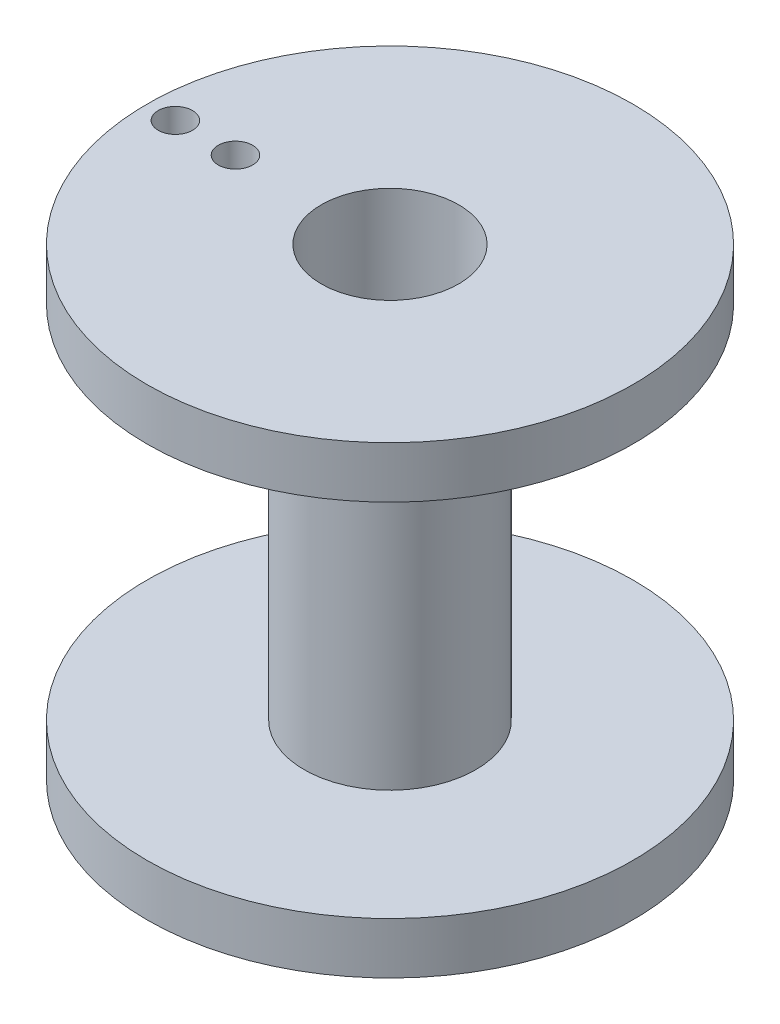
ISO-10303-21;
HEADER;
FILE_DESCRIPTION(('STEP AP214'),'2;1');
FILE_NAME('part.step','',(''),(''),'','','');
FILE_SCHEMA(('AUTOMOTIVE_DESIGN { 1 0 10303 214 1 1 1 1 }'));
ENDSEC;
DATA;
#1=APPLICATION_CONTEXT('core data for automotive mechanical design processes');
#2=APPLICATION_PROTOCOL_DEFINITION('international standard','automotive_design',2000,#1);
#3=PRODUCT_CONTEXT('',#1,'mechanical');
#4=PRODUCT('Part','Part','',(#3));
#5=PRODUCT_RELATED_PRODUCT_CATEGORY('part','',(#4));
#6=PRODUCT_DEFINITION_FORMATION('','',#4);
#7=PRODUCT_DEFINITION_CONTEXT('part definition',#1,'design');
#8=PRODUCT_DEFINITION('design','',#6,#7);
#9=PRODUCT_DEFINITION_SHAPE('','',#8);
#10=(LENGTH_UNIT() NAMED_UNIT(*) SI_UNIT(.MILLI.,.METRE.));
#11=(NAMED_UNIT(*) PLANE_ANGLE_UNIT() SI_UNIT($,.RADIAN.));
#12=(NAMED_UNIT(*) SI_UNIT($,.STERADIAN.) SOLID_ANGLE_UNIT());
#13=UNCERTAINTY_MEASURE_WITH_UNIT(LENGTH_MEASURE(1.E-05),#10,'distance_accuracy_value','');
#14=(GEOMETRIC_REPRESENTATION_CONTEXT(3) GLOBAL_UNCERTAINTY_ASSIGNED_CONTEXT((#13)) GLOBAL_UNIT_ASSIGNED_CONTEXT((#10,
#11,#12)) REPRESENTATION_CONTEXT('',''));
#15=CARTESIAN_POINT('',(0.,0.,0.));
#16=DIRECTION('',(0.,0.,1.));
#17=DIRECTION('',(1.,0.,0.));
#18=AXIS2_PLACEMENT_3D('',#15,#16,#17);
#19=CARTESIAN_POINT('',(0.,3.,0.));
#20=DIRECTION('',(0.,-1.,0.));
#21=DIRECTION('',(0.,0.,-1.));
#22=AXIS2_PLACEMENT_3D('',#19,#20,#21);
#23=CYLINDRICAL_SURFACE('',#22,14.15);
#24=CARTESIAN_POINT('',(0.,3.,0.));
#25=DIRECTION('',(0.,1.,0.));
#26=DIRECTION('',(0.,0.,1.));
#27=AXIS2_PLACEMENT_3D('',#24,#25,#26);
#28=CIRCLE('',#27,14.15);
#29=CARTESIAN_POINT('',(0.,3.,14.15));
#30=VERTEX_POINT('',#29);
#31=EDGE_CURVE('E45',#30,#30,#28,.T.);
#32=ORIENTED_EDGE('',*,*,#31,.F.);
#33=EDGE_LOOP('',(#32));
#34=FACE_BOUND('',#33,.T.);
#35=CARTESIAN_POINT('',(0.,0.,0.));
#36=DIRECTION('',(0.,1.,0.));
#37=DIRECTION('',(0.,0.,1.));
#38=AXIS2_PLACEMENT_3D('',#35,#36,#37);
#39=CIRCLE('',#38,14.15);
#40=CARTESIAN_POINT('',(0.,0.,14.15));
#41=VERTEX_POINT('',#40);
#42=EDGE_CURVE('E40',#41,#41,#39,.T.);
#43=ORIENTED_EDGE('',*,*,#42,.T.);
#44=EDGE_LOOP('',(#43));
#45=FACE_BOUND('',#44,.T.);
#46=ADVANCED_FACE('F37',(#34,#45),#23,.T.);
#47=CARTESIAN_POINT('',(0.,3.,0.));
#48=DIRECTION('',(0.,1.,0.));
#49=DIRECTION('',(0.,0.,1.));
#50=AXIS2_PLACEMENT_3D('',#47,#48,#49);
#51=PLANE('',#50);
#52=CARTESIAN_POINT('',(0.,3.,0.));
#53=DIRECTION('',(0.,1.,0.));
#54=DIRECTION('',(0.,0.,1.));
#55=AXIS2_PLACEMENT_3D('',#52,#53,#54);
#56=CIRCLE('',#55,5.);
#57=CARTESIAN_POINT('',(0.,3.,-5.));
#58=VERTEX_POINT('',#57);
#59=EDGE_CURVE('E10',#58,#58,#56,.T.);
#60=ORIENTED_EDGE('',*,*,#59,.F.);
#61=EDGE_LOOP('',(#60));
#62=FACE_BOUND('',#61,.T.);
#63=ORIENTED_EDGE('',*,*,#31,.T.);
#64=EDGE_LOOP('',(#63));
#65=FACE_BOUND('',#64,.T.);
#66=ADVANCED_FACE('F119',(#62,#65),#51,.T.);
#67=CARTESIAN_POINT('',(0.,0.,0.));
#68=DIRECTION('',(0.,1.,0.));
#69=DIRECTION('',(0.,0.,1.));
#70=AXIS2_PLACEMENT_3D('',#67,#68,#69);
#71=PLANE('',#70);
#72=CARTESIAN_POINT('',(0.,0.,0.));
#73=DIRECTION('',(0.,1.,0.));
#74=DIRECTION('',(0.,0.,1.));
#75=AXIS2_PLACEMENT_3D('',#72,#73,#74);
#76=CIRCLE('',#75,4.);
#77=CARTESIAN_POINT('',(0.,0.,4.));
#78=VERTEX_POINT('',#77);
#79=EDGE_CURVE('E61',#78,#78,#76,.T.);
#80=ORIENTED_EDGE('',*,*,#79,.T.);
#81=EDGE_LOOP('',(#80));
#82=FACE_BOUND('',#81,.T.);
#83=ORIENTED_EDGE('',*,*,#42,.F.);
#84=EDGE_LOOP('',(#83));
#85=FACE_BOUND('',#84,.T.);
#86=ADVANCED_FACE('F114',(#82,#85),#71,.F.);
#87=CARTESIAN_POINT('',(0.,24.,0.));
#88=DIRECTION('',(0.,-1.,0.));
#89=DIRECTION('',(0.,0.,-1.));
#90=AXIS2_PLACEMENT_3D('',#87,#88,#89);
#91=CYLINDRICAL_SURFACE('',#90,5.);
#92=CARTESIAN_POINT('',(0.,24.,0.));
#93=DIRECTION('',(0.,1.,0.));
#94=DIRECTION('',(0.,0.,1.));
#95=AXIS2_PLACEMENT_3D('',#92,#93,#94);
#96=CIRCLE('',#95,5.);
#97=CARTESIAN_POINT('',(0.,24.,-5.));
#98=VERTEX_POINT('',#97);
#99=EDGE_CURVE('E52',#98,#98,#96,.T.);
#100=CARTESIAN_POINT('',(0.,24.,-5.));
#101=CARTESIAN_POINT('',(0.,23.78125,-5.));
#102=CARTESIAN_POINT('',(0.,23.5625,-5.));
#103=CARTESIAN_POINT('',(0.,23.125,-5.));
#104=CARTESIAN_POINT('',(0.,22.90625,-5.));
#105=CARTESIAN_POINT('',(0.,22.46875,-5.));
#106=CARTESIAN_POINT('',(0.,22.25,-5.));
#107=CARTESIAN_POINT('',(0.,21.8125,-5.));
#108=CARTESIAN_POINT('',(0.,21.59375,-5.));
#109=CARTESIAN_POINT('',(0.,21.15625,-5.));
#110=CARTESIAN_POINT('',(0.,20.9375,-5.));
#111=CARTESIAN_POINT('',(0.,20.5,-5.));
#112=CARTESIAN_POINT('',(0.,20.28125,-5.));
#113=CARTESIAN_POINT('',(0.,19.84375,-5.));
#114=CARTESIAN_POINT('',(0.,19.625,-5.));
#115=CARTESIAN_POINT('',(0.,19.1875,-5.));
#116=CARTESIAN_POINT('',(0.,18.96875,-5.));
#117=CARTESIAN_POINT('',(0.,18.53125,-5.));
#118=CARTESIAN_POINT('',(0.,18.3125,-5.));
#119=CARTESIAN_POINT('',(0.,17.875,-5.));
#120=CARTESIAN_POINT('',(0.,17.65625,-5.));
#121=CARTESIAN_POINT('',(0.,17.21875,-5.));
#122=CARTESIAN_POINT('',(0.,17.,-5.));
#123=CARTESIAN_POINT('',(0.,16.5625,-5.));
#124=CARTESIAN_POINT('',(0.,16.34375,-5.));
#125=CARTESIAN_POINT('',(0.,15.90625,-5.));
#126=CARTESIAN_POINT('',(0.,15.6875,-5.));
#127=CARTESIAN_POINT('',(0.,15.25,-5.));
#128=CARTESIAN_POINT('',(0.,15.03125,-5.));
#129=CARTESIAN_POINT('',(0.,14.59375,-5.));
#130=CARTESIAN_POINT('',(0.,14.375,-5.));
#131=CARTESIAN_POINT('',(0.,13.9375,-5.));
#132=CARTESIAN_POINT('',(0.,13.71875,-5.));
#133=CARTESIAN_POINT('',(0.,13.28125,-5.));
#134=CARTESIAN_POINT('',(0.,13.0625,-5.));
#135=CARTESIAN_POINT('',(0.,12.625,-5.));
#136=CARTESIAN_POINT('',(0.,12.40625,-5.));
#137=CARTESIAN_POINT('',(0.,11.96875,-5.));
#138=CARTESIAN_POINT('',(0.,11.75,-5.));
#139=CARTESIAN_POINT('',(0.,11.3125,-5.));
#140=CARTESIAN_POINT('',(0.,11.09375,-5.));
#141=CARTESIAN_POINT('',(0.,10.65625,-5.));
#142=CARTESIAN_POINT('',(0.,10.4375,-5.));
#143=CARTESIAN_POINT('',(0.,10.,-5.));
#144=CARTESIAN_POINT('',(0.,9.78125,-5.));
#145=CARTESIAN_POINT('',(0.,9.34375,-5.));
#146=CARTESIAN_POINT('',(0.,9.125,-5.));
#147=CARTESIAN_POINT('',(0.,8.6875,-5.));
#148=CARTESIAN_POINT('',(0.,8.46875,-5.));
#149=CARTESIAN_POINT('',(0.,8.03125,-5.));
#150=CARTESIAN_POINT('',(0.,7.8125,-5.));
#151=CARTESIAN_POINT('',(0.,7.375,-5.));
#152=CARTESIAN_POINT('',(0.,7.15625,-5.));
#153=CARTESIAN_POINT('',(0.,6.71875,-5.));
#154=CARTESIAN_POINT('',(0.,6.5,-5.));
#155=CARTESIAN_POINT('',(0.,6.0625,-5.));
#156=CARTESIAN_POINT('',(0.,5.84375,-5.));
#157=CARTESIAN_POINT('',(0.,5.40625,-5.));
#158=CARTESIAN_POINT('',(0.,5.1875,-5.));
#159=CARTESIAN_POINT('',(0.,4.75,-5.));
#160=CARTESIAN_POINT('',(0.,4.53125,-5.));
#161=CARTESIAN_POINT('',(0.,4.09375,-5.));
#162=CARTESIAN_POINT('',(0.,3.875,-5.));
#163=CARTESIAN_POINT('',(0.,3.4375,-5.));
#164=CARTESIAN_POINT('',(0.,3.21875,-5.));
#165=CARTESIAN_POINT('',(0.,3.,-5.));
#166=B_SPLINE_CURVE_WITH_KNOTS('',3,(#100,#101,#102,#103,#104,#105,#106,#107,#108,#109,#110,
#111,#112,#113,#114,#115,#116,#117,#118,#119,#120,#121,#122,#123,#124,#125,#126,#127,#128,#129,
#130,#131,#132,#133,#134,#135,#136,#137,#138,#139,#140,#141,#142,#143,#144,#145,#146,#147,#148,
#149,#150,#151,#152,#153,#154,#155,#156,#157,#158,#159,#160,#161,#162,#163,#164,#165),
.UNSPECIFIED.,.F.,.F.,(4,2,2,2,2,2,2,2,2,2,2,2,2,2,2,2,2,2,2,2,2,2,2,2,2,2,2,2,2,2,2,2,4),(0.,
0.656250000000001,1.3125,1.96875,2.625,3.28125,3.9375,4.59375,5.25,5.90625,6.5625,7.21875,7.875,
8.53125,9.1875,9.84375,10.5,11.15625,11.8125,12.46875,13.125,13.78125,14.4375,15.09375,15.75,
16.40625,17.0625,17.71875,18.375,19.03125,19.6875,20.34375,21.),.UNSPECIFIED.);
#167=EDGE_CURVE('BSEAM105',#98,#58,#166,.T.);
#168=ORIENTED_EDGE('',*,*,#99,.F.);
#169=ORIENTED_EDGE('',*,*,#59,.T.);
#170=ORIENTED_EDGE('',*,*,#167,.T.);
#171=ORIENTED_EDGE('',*,*,#167,.F.);
#172=EDGE_LOOP('',(#168,#170,#169,#171));
#173=FACE_BOUND('',#172,.T.);
#174=ADVANCED_FACE('F105',(#173),#91,.T.);
#175=CARTESIAN_POINT('',(0.,27.,0.));
#176=DIRECTION('',(0.,-1.,0.));
#177=DIRECTION('',(0.,0.,-1.));
#178=AXIS2_PLACEMENT_3D('',#175,#176,#177);
#179=CYLINDRICAL_SURFACE('',#178,14.15);
#180=CARTESIAN_POINT('',(0.,27.,0.));
#181=DIRECTION('',(0.,1.,0.));
#182=DIRECTION('',(0.,0.,1.));
#183=AXIS2_PLACEMENT_3D('',#180,#181,#182);
#184=CIRCLE('',#183,14.15);
#185=CARTESIAN_POINT('',(0.,27.,14.15));
#186=VERTEX_POINT('',#185);
#187=EDGE_CURVE('E56',#186,#186,#184,.T.);
#188=ORIENTED_EDGE('',*,*,#187,.F.);
#189=EDGE_LOOP('',(#188));
#190=FACE_BOUND('',#189,.T.);
#191=CARTESIAN_POINT('',(0.,24.,0.));
#192=DIRECTION('',(0.,1.,0.));
#193=DIRECTION('',(0.,0.,1.));
#194=AXIS2_PLACEMENT_3D('',#191,#192,#193);
#195=CIRCLE('',#194,14.15);
#196=CARTESIAN_POINT('',(0.,24.,14.15));
#197=VERTEX_POINT('',#196);
#198=EDGE_CURVE('E57',#197,#197,#195,.T.);
#199=ORIENTED_EDGE('',*,*,#198,.T.);
#200=EDGE_LOOP('',(#199));
#201=FACE_BOUND('',#200,.T.);
#202=ADVANCED_FACE('F103',(#190,#201),#179,.T.);
#203=CARTESIAN_POINT('',(0.,27.,0.));
#204=DIRECTION('',(0.,1.,0.));
#205=DIRECTION('',(0.,0.,1.));
#206=AXIS2_PLACEMENT_3D('',#203,#204,#205);
#207=PLANE('',#206);
#208=CARTESIAN_POINT('',(-9.,27.,0.));
#209=DIRECTION('',(0.,1.,0.));
#210=DIRECTION('',(0.,0.,1.));
#211=AXIS2_PLACEMENT_3D('',#208,#209,#210);
#212=CIRCLE('',#211,1.);
#213=CARTESIAN_POINT('',(-9.,27.,1.));
#214=VERTEX_POINT('',#213);
#215=EDGE_CURVE('E69',#214,#214,#212,.T.);
#216=ORIENTED_EDGE('',*,*,#215,.F.);
#217=EDGE_LOOP('',(#216));
#218=FACE_BOUND('',#217,.T.);
#219=CARTESIAN_POINT('',(-12.5,27.,0.));
#220=DIRECTION('',(0.,1.,0.));
#221=DIRECTION('',(0.,0.,1.));
#222=AXIS2_PLACEMENT_3D('',#219,#220,#221);
#223=CIRCLE('',#222,1.);
#224=CARTESIAN_POINT('',(-12.5,27.,1.));
#225=VERTEX_POINT('',#224);
#226=EDGE_CURVE('E73',#225,#225,#223,.T.);
#227=ORIENTED_EDGE('',*,*,#226,.F.);
#228=EDGE_LOOP('',(#227));
#229=FACE_BOUND('',#228,.T.);
#230=CARTESIAN_POINT('',(0.,27.,0.));
#231=DIRECTION('',(0.,1.,0.));
#232=DIRECTION('',(0.,0.,1.));
#233=AXIS2_PLACEMENT_3D('',#230,#231,#232);
#234=CIRCLE('',#233,4.);
#235=CARTESIAN_POINT('',(0.,27.,4.));
#236=VERTEX_POINT('',#235);
#237=EDGE_CURVE('E65',#236,#236,#234,.T.);
#238=ORIENTED_EDGE('',*,*,#237,.F.);
#239=EDGE_LOOP('',(#238));
#240=FACE_BOUND('',#239,.T.);
#241=ORIENTED_EDGE('',*,*,#187,.T.);
#242=EDGE_LOOP('',(#241));
#243=FACE_BOUND('',#242,.T.);
#244=ADVANCED_FACE('F95',(#218,#229,#240,#243),#207,.T.);
#245=CARTESIAN_POINT('',(0.,24.,0.));
#246=DIRECTION('',(0.,1.,0.));
#247=DIRECTION('',(0.,0.,1.));
#248=AXIS2_PLACEMENT_3D('',#245,#246,#247);
#249=PLANE('',#248);
#250=CARTESIAN_POINT('',(-9.,24.,0.));
#251=DIRECTION('',(0.,1.,0.));
#252=DIRECTION('',(0.,0.,1.));
#253=AXIS2_PLACEMENT_3D('',#250,#251,#252);
#254=CIRCLE('',#253,1.);
#255=CARTESIAN_POINT('',(-9.,24.,1.));
#256=VERTEX_POINT('',#255);
#257=EDGE_CURVE('E77',#256,#256,#254,.F.);
#258=ORIENTED_EDGE('',*,*,#257,.F.);
#259=EDGE_LOOP('',(#258));
#260=FACE_BOUND('',#259,.T.);
#261=CARTESIAN_POINT('',(-12.5,24.,0.));
#262=DIRECTION('',(0.,1.,0.));
#263=DIRECTION('',(0.,0.,1.));
#264=AXIS2_PLACEMENT_3D('',#261,#262,#263);
#265=CIRCLE('',#264,1.);
#266=CARTESIAN_POINT('',(-12.5,24.,1.));
#267=VERTEX_POINT('',#266);
#268=EDGE_CURVE('E78',#267,#267,#265,.F.);
#269=ORIENTED_EDGE('',*,*,#268,.F.);
#270=EDGE_LOOP('',(#269));
#271=FACE_BOUND('',#270,.T.);
#272=ORIENTED_EDGE('',*,*,#99,.T.);
#273=EDGE_LOOP('',(#272));
#274=FACE_BOUND('',#273,.T.);
#275=ORIENTED_EDGE('',*,*,#198,.F.);
#276=EDGE_LOOP('',(#275));
#277=FACE_BOUND('',#276,.T.);
#278=ADVANCED_FACE('F91',(#260,#271,#274,#277),#249,.F.);
#279=CARTESIAN_POINT('',(0.,0.,0.));
#280=DIRECTION('',(0.,1.,0.));
#281=DIRECTION('',(0.,0.,1.));
#282=AXIS2_PLACEMENT_3D('',#279,#280,#281);
#283=CYLINDRICAL_SURFACE('',#282,4.);
#284=ORIENTED_EDGE('',*,*,#79,.F.);
#285=EDGE_LOOP('',(#284));
#286=FACE_BOUND('',#285,.T.);
#287=ORIENTED_EDGE('',*,*,#237,.T.);
#288=EDGE_LOOP('',(#287));
#289=FACE_BOUND('',#288,.T.);
#290=ADVANCED_FACE('F94',(#286,#289),#283,.F.);
#291=CARTESIAN_POINT('',(-12.5,-0.001000000000001,0.));
#292=DIRECTION('',(0.,1.,0.));
#293=DIRECTION('',(0.,0.,1.));
#294=AXIS2_PLACEMENT_3D('',#291,#292,#293);
#295=CYLINDRICAL_SURFACE('',#294,1.);
#296=ORIENTED_EDGE('',*,*,#226,.T.);
#297=EDGE_LOOP('',(#296));
#298=FACE_BOUND('',#297,.T.);
#299=ORIENTED_EDGE('',*,*,#268,.T.);
#300=EDGE_LOOP('',(#299));
#301=FACE_BOUND('',#300,.T.);
#302=ADVANCED_FACE('F140',(#298,#301),#295,.F.);
#303=CARTESIAN_POINT('',(-9.,-0.001000000000001,0.));
#304=DIRECTION('',(0.,1.,0.));
#305=DIRECTION('',(0.,0.,1.));
#306=AXIS2_PLACEMENT_3D('',#303,#304,#305);
#307=CYLINDRICAL_SURFACE('',#306,1.);
#308=ORIENTED_EDGE('',*,*,#215,.T.);
#309=EDGE_LOOP('',(#308));
#310=FACE_BOUND('',#309,.T.);
#311=ORIENTED_EDGE('',*,*,#257,.T.);
#312=EDGE_LOOP('',(#311));
#313=FACE_BOUND('',#312,.T.);
#314=ADVANCED_FACE('F89',(#310,#313),#307,.F.);
#315=CLOSED_SHELL('',(#46,#66,#86,#174,#202,#244,#278,#290,#302,#314));
#316=MANIFOLD_SOLID_BREP('B2',#315);
#317=ADVANCED_BREP_SHAPE_REPRESENTATION('',(#18,#316),#14);
#318=SHAPE_DEFINITION_REPRESENTATION(#9,#317);
ENDSEC;
END-ISO-10303-21;
